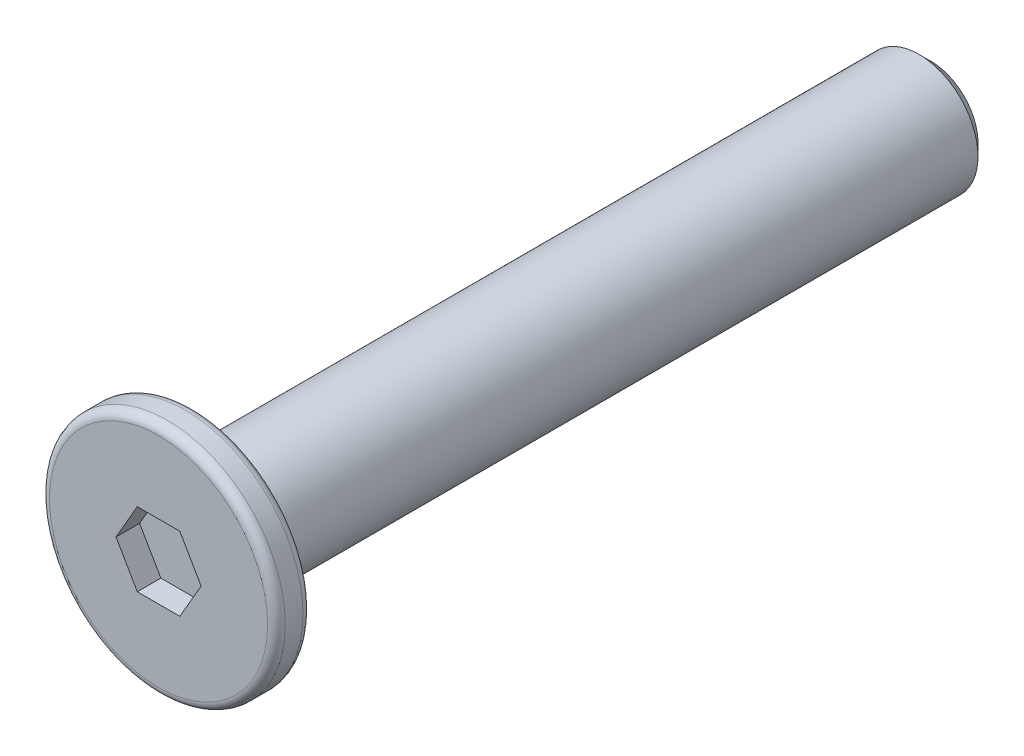
ISO-10303-21;
HEADER;
FILE_DESCRIPTION(('STEP AP214'),'2;1');
FILE_NAME('part.step','',(''),(''),'','','');
FILE_SCHEMA(('AUTOMOTIVE_DESIGN { 1 0 10303 214 1 1 1 1 }'));
ENDSEC;
DATA;
#1=APPLICATION_CONTEXT('core data for automotive mechanical design processes');
#2=APPLICATION_PROTOCOL_DEFINITION('international standard','automotive_design',2000,#1);
#3=PRODUCT_CONTEXT('',#1,'mechanical');
#4=PRODUCT('Part','Part','',(#3));
#5=PRODUCT_RELATED_PRODUCT_CATEGORY('part','',(#4));
#6=PRODUCT_DEFINITION_FORMATION('','',#4);
#7=PRODUCT_DEFINITION_CONTEXT('part definition',#1,'design');
#8=PRODUCT_DEFINITION('design','',#6,#7);
#9=PRODUCT_DEFINITION_SHAPE('','',#8);
#10=(LENGTH_UNIT() NAMED_UNIT(*) SI_UNIT(.MILLI.,.METRE.));
#11=(NAMED_UNIT(*) PLANE_ANGLE_UNIT() SI_UNIT($,.RADIAN.));
#12=(NAMED_UNIT(*) SI_UNIT($,.STERADIAN.) SOLID_ANGLE_UNIT());
#13=UNCERTAINTY_MEASURE_WITH_UNIT(LENGTH_MEASURE(1.E-05),#10,'distance_accuracy_value','');
#14=(GEOMETRIC_REPRESENTATION_CONTEXT(3) GLOBAL_UNCERTAINTY_ASSIGNED_CONTEXT((#13)) GLOBAL_UNIT_ASSIGNED_CONTEXT((#10,
#11,#12)) REPRESENTATION_CONTEXT('',''));
#15=CARTESIAN_POINT('',(0.,0.,0.));
#16=DIRECTION('',(0.,0.,1.));
#17=DIRECTION('',(1.,0.,0.));
#18=AXIS2_PLACEMENT_3D('',#15,#16,#17);
#19=CARTESIAN_POINT('',(0.,0.,0.6));
#20=DIRECTION('',(0.,0.,-1.));
#21=DIRECTION('',(-1.,0.,0.));
#22=AXIS2_PLACEMENT_3D('',#19,#20,#21);
#23=CYLINDRICAL_SURFACE('',#22,4.);
#24=CARTESIAN_POINT('',(0.,0.,-0.3));
#25=DIRECTION('',(0.,0.,1.));
#26=DIRECTION('',(1.,0.,0.));
#27=AXIS2_PLACEMENT_3D('',#24,#25,#26);
#28=CIRCLE('',#27,4.);
#29=CARTESIAN_POINT('',(4.,0.,-0.3));
#30=VERTEX_POINT('',#29);
#31=EDGE_CURVE('E154',#30,#30,#28,.T.);
#32=ORIENTED_EDGE('',*,*,#31,.T.);
#33=EDGE_LOOP('',(#32));
#34=FACE_BOUND('',#33,.T.);
#35=CARTESIAN_POINT('',(0.,0.,0.3));
#36=DIRECTION('',(0.,0.,1.));
#37=DIRECTION('',(1.,0.,0.));
#38=AXIS2_PLACEMENT_3D('',#35,#36,#37);
#39=CIRCLE('',#38,4.);
#40=CARTESIAN_POINT('',(4.,0.,0.3));
#41=VERTEX_POINT('',#40);
#42=EDGE_CURVE('E151',#41,#41,#39,.F.);
#43=ORIENTED_EDGE('',*,*,#42,.T.);
#44=EDGE_LOOP('',(#43));
#45=FACE_BOUND('',#44,.T.);
#46=ADVANCED_FACE('F35',(#34,#45),#23,.T.);
#47=CARTESIAN_POINT('',(0.,0.,0.6));
#48=DIRECTION('',(0.,0.,1.));
#49=DIRECTION('',(1.,0.,0.));
#50=AXIS2_PLACEMENT_3D('',#47,#48,#49);
#51=PLANE('',#50);
#52=CARTESIAN_POINT('',(0.,0.,0.6));
#53=DIRECTION('',(0.,0.,1.));
#54=DIRECTION('',(1.,0.,0.));
#55=AXIS2_PLACEMENT_3D('',#52,#53,#54);
#56=CIRCLE('',#55,3.7);
#57=CARTESIAN_POINT('',(3.7,0.,0.6));
#58=VERTEX_POINT('',#57);
#59=EDGE_CURVE('E11',#58,#58,#56,.T.);
#60=ORIENTED_EDGE('',*,*,#59,.T.);
#61=EDGE_LOOP('',(#60));
#62=FACE_BOUND('',#61,.T.);
#63=DIRECTION('',(0.5,0.866025403784439,0.));
#64=VECTOR('',#63,1.);
#65=CARTESIAN_POINT('',(0.721687836487033,-1.25,0.6));
#66=LINE('',#65,#64);
#67=CARTESIAN_POINT('',(0.721687836487033,-1.25,0.6));
#68=VERTEX_POINT('',#67);
#69=CARTESIAN_POINT('',(1.44337567297407,0.,0.6));
#70=VERTEX_POINT('',#69);
#71=EDGE_CURVE('E50',#68,#70,#66,.T.);
#72=ORIENTED_EDGE('',*,*,#71,.F.);
#73=DIRECTION('',(1.,0.,0.));
#74=VECTOR('',#73,1.);
#75=CARTESIAN_POINT('',(-0.721687836487031,-1.25,0.6));
#76=LINE('',#75,#74);
#77=CARTESIAN_POINT('',(-0.721687836487031,-1.25,0.6));
#78=VERTEX_POINT('',#77);
#79=EDGE_CURVE('E133',#78,#68,#76,.T.);
#80=ORIENTED_EDGE('',*,*,#79,.F.);
#81=DIRECTION('',(0.5,-0.866025403784438,0.));
#82=VECTOR('',#81,1.);
#83=CARTESIAN_POINT('',(-1.44337567297406,0.,0.6));
#84=LINE('',#83,#82);
#85=CARTESIAN_POINT('',(-1.44337567297406,0.,0.6));
#86=VERTEX_POINT('',#85);
#87=EDGE_CURVE('E131',#86,#78,#84,.T.);
#88=ORIENTED_EDGE('',*,*,#87,.F.);
#89=DIRECTION('',(-0.5,-0.866025403784439,0.));
#90=VECTOR('',#89,1.);
#91=CARTESIAN_POINT('',(-0.721687836487032,1.25,0.6));
#92=LINE('',#91,#90);
#93=CARTESIAN_POINT('',(-0.721687836487032,1.25,0.6));
#94=VERTEX_POINT('',#93);
#95=EDGE_CURVE('E98',#94,#86,#92,.T.);
#96=ORIENTED_EDGE('',*,*,#95,.F.);
#97=DIRECTION('',(-1.,0.,0.));
#98=VECTOR('',#97,1.);
#99=CARTESIAN_POINT('',(0.721687836487032,1.25,0.6));
#100=LINE('',#99,#98);
#101=CARTESIAN_POINT('',(0.721687836487032,1.25,0.6));
#102=VERTEX_POINT('',#101);
#103=EDGE_CURVE('E127',#102,#94,#100,.T.);
#104=ORIENTED_EDGE('',*,*,#103,.F.);
#105=DIRECTION('',(-0.500000000000001,0.866025403784438,0.));
#106=VECTOR('',#105,1.);
#107=CARTESIAN_POINT('',(1.44337567297407,0.,0.6));
#108=LINE('',#107,#106);
#109=EDGE_CURVE('E124',#70,#102,#108,.T.);
#110=ORIENTED_EDGE('',*,*,#109,.F.);
#111=EDGE_LOOP('',(#72,#80,#88,#96,#104,#110));
#112=FACE_BOUND('',#111,.T.);
#113=ADVANCED_FACE('F169',(#62,#112),#51,.T.);
#114=CARTESIAN_POINT('',(0.,0.,-0.6));
#115=DIRECTION('',(0.,0.,1.));
#116=DIRECTION('',(1.,0.,0.));
#117=AXIS2_PLACEMENT_3D('',#114,#115,#116);
#118=PLANE('',#117);
#119=CARTESIAN_POINT('',(0.,0.,-0.6));
#120=DIRECTION('',(0.,0.,1.));
#121=DIRECTION('',(1.,0.,0.));
#122=AXIS2_PLACEMENT_3D('',#119,#120,#121);
#123=CIRCLE('',#122,3.7);
#124=CARTESIAN_POINT('',(3.7,0.,-0.6));
#125=VERTEX_POINT('',#124);
#126=EDGE_CURVE('E43',#125,#125,#123,.F.);
#127=ORIENTED_EDGE('',*,*,#126,.T.);
#128=EDGE_LOOP('',(#127));
#129=FACE_BOUND('',#128,.T.);
#130=CARTESIAN_POINT('',(0.,0.,-0.6));
#131=DIRECTION('',(0.,0.,-1.));
#132=DIRECTION('',(-1.,0.,0.));
#133=AXIS2_PLACEMENT_3D('',#130,#131,#132);
#134=CIRCLE('',#133,2.);
#135=CARTESIAN_POINT('',(-2.,0.,-0.6));
#136=VERTEX_POINT('',#135);
#137=EDGE_CURVE('E137',#136,#136,#134,.T.);
#138=ORIENTED_EDGE('',*,*,#137,.F.);
#139=EDGE_LOOP('',(#138));
#140=FACE_BOUND('',#139,.T.);
#141=ADVANCED_FACE('F159',(#129,#140),#118,.F.);
#142=CARTESIAN_POINT('',(0.,0.,-25.6));
#143=DIRECTION('',(0.,0.,1.));
#144=DIRECTION('',(1.,0.,0.));
#145=AXIS2_PLACEMENT_3D('',#142,#143,#144);
#146=CYLINDRICAL_SURFACE('',#145,2.);
#147=CARTESIAN_POINT('',(0.,0.,-25.2));
#148=DIRECTION('',(0.,0.,-1.));
#149=DIRECTION('',(-1.,0.,0.));
#150=AXIS2_PLACEMENT_3D('',#147,#148,#149);
#151=CIRCLE('',#150,2.);
#152=CARTESIAN_POINT('',(-2.,0.,-25.2));
#153=VERTEX_POINT('',#152);
#154=EDGE_CURVE('E148',#153,#153,#151,.F.);
#155=ORIENTED_EDGE('',*,*,#154,.T.);
#156=EDGE_LOOP('',(#155));
#157=FACE_BOUND('',#156,.T.);
#158=ORIENTED_EDGE('',*,*,#137,.T.);
#159=EDGE_LOOP('',(#158));
#160=FACE_BOUND('',#159,.T.);
#161=ADVANCED_FACE('F204',(#157,#160),#146,.T.);
#162=CARTESIAN_POINT('',(0.,0.,-25.6));
#163=DIRECTION('',(0.,0.,-1.));
#164=DIRECTION('',(-1.,0.,0.));
#165=AXIS2_PLACEMENT_3D('',#162,#163,#164);
#166=PLANE('',#165);
#167=CARTESIAN_POINT('',(0.,0.,-25.6));
#168=DIRECTION('',(0.,0.,-1.));
#169=DIRECTION('',(-1.,0.,0.));
#170=AXIS2_PLACEMENT_3D('',#167,#168,#169);
#171=CIRCLE('',#170,1.6);
#172=CARTESIAN_POINT('',(-1.6,0.,-25.6));
#173=VERTEX_POINT('',#172);
#174=EDGE_CURVE('E145',#173,#173,#171,.T.);
#175=ORIENTED_EDGE('',*,*,#174,.T.);
#176=EDGE_LOOP('',(#175));
#177=FACE_BOUND('',#176,.T.);
#178=ADVANCED_FACE('F196',(#177),#166,.T.);
#179=CARTESIAN_POINT('',(0.,0.,-25.6));
#180=DIRECTION('',(0.,0.,1.));
#181=DIRECTION('',(1.,0.,0.));
#182=AXIS2_PLACEMENT_3D('',#179,#180,#181);
#183=CONICAL_SURFACE('',#182,1.6,0.78539816339745);
#184=ORIENTED_EDGE('',*,*,#154,.F.);
#185=EDGE_LOOP('',(#184));
#186=FACE_BOUND('',#185,.T.);
#187=ORIENTED_EDGE('',*,*,#174,.F.);
#188=EDGE_LOOP('',(#187));
#189=FACE_BOUND('',#188,.T.);
#190=ADVANCED_FACE('F189',(#186,#189),#183,.T.);
#191=CARTESIAN_POINT('',(0.721687836487033,-1.25,-0.2));
#192=DIRECTION('',(0.866025403784439,-0.5,0.));
#193=DIRECTION('',(0.5,0.866025403784439,0.));
#194=AXIS2_PLACEMENT_3D('',#191,#192,#193);
#195=PLANE('',#194);
#196=ORIENTED_EDGE('',*,*,#71,.T.);
#197=DIRECTION('',(0.,0.,1.));
#198=VECTOR('',#197,1.);
#199=CARTESIAN_POINT('',(1.44337567297407,0.,-0.2));
#200=LINE('',#199,#198);
#201=CARTESIAN_POINT('',(1.44337567297407,0.,-0.2));
#202=VERTEX_POINT('',#201);
#203=EDGE_CURVE('E80',#202,#70,#200,.T.);
#204=ORIENTED_EDGE('',*,*,#203,.F.);
#205=DIRECTION('',(0.5,0.866025403784439,0.));
#206=VECTOR('',#205,1.);
#207=CARTESIAN_POINT('',(0.721687836487033,-1.25,-0.2));
#208=LINE('',#207,#206);
#209=CARTESIAN_POINT('',(0.721687836487033,-1.25,-0.2));
#210=VERTEX_POINT('',#209);
#211=EDGE_CURVE('E135',#210,#202,#208,.T.);
#212=ORIENTED_EDGE('',*,*,#211,.F.);
#213=DIRECTION('',(0.,0.,1.));
#214=VECTOR('',#213,1.);
#215=CARTESIAN_POINT('',(0.721687836487033,-1.25,-0.2));
#216=LINE('',#215,#214);
#217=EDGE_CURVE('E58',#210,#68,#216,.T.);
#218=ORIENTED_EDGE('',*,*,#217,.T.);
#219=EDGE_LOOP('',(#196,#204,#212,#218));
#220=FACE_BOUND('',#219,.T.);
#221=ADVANCED_FACE('F186',(#220),#195,.F.);
#222=CARTESIAN_POINT('',(-0.721687836487031,-1.25,-0.2));
#223=DIRECTION('',(0.,-1.,0.));
#224=DIRECTION('',(0.,0.,-1.));
#225=AXIS2_PLACEMENT_3D('',#222,#223,#224);
#226=PLANE('',#225);
#227=ORIENTED_EDGE('',*,*,#79,.T.);
#228=ORIENTED_EDGE('',*,*,#217,.F.);
#229=DIRECTION('',(1.,0.,0.));
#230=VECTOR('',#229,1.);
#231=CARTESIAN_POINT('',(-0.721687836487031,-1.25,-0.2));
#232=LINE('',#231,#230);
#233=CARTESIAN_POINT('',(-0.721687836487031,-1.25,-0.2));
#234=VERTEX_POINT('',#233);
#235=EDGE_CURVE('E110',#234,#210,#232,.T.);
#236=ORIENTED_EDGE('',*,*,#235,.F.);
#237=DIRECTION('',(0.,0.,1.));
#238=VECTOR('',#237,1.);
#239=CARTESIAN_POINT('',(-0.721687836487031,-1.25,-0.2));
#240=LINE('',#239,#238);
#241=EDGE_CURVE('E102',#234,#78,#240,.T.);
#242=ORIENTED_EDGE('',*,*,#241,.T.);
#243=EDGE_LOOP('',(#227,#228,#236,#242));
#244=FACE_BOUND('',#243,.T.);
#245=ADVANCED_FACE('F188',(#244),#226,.F.);
#246=CARTESIAN_POINT('',(-1.44337567297406,0.,-0.2));
#247=DIRECTION('',(-0.866025403784438,-0.5,0.));
#248=DIRECTION('',(0.5,-0.866025403784438,0.));
#249=AXIS2_PLACEMENT_3D('',#246,#247,#248);
#250=PLANE('',#249);
#251=ORIENTED_EDGE('',*,*,#87,.T.);
#252=ORIENTED_EDGE('',*,*,#241,.F.);
#253=DIRECTION('',(0.5,-0.866025403784438,0.));
#254=VECTOR('',#253,1.);
#255=CARTESIAN_POINT('',(-1.44337567297406,0.,-0.2));
#256=LINE('',#255,#254);
#257=CARTESIAN_POINT('',(-1.44337567297406,0.,-0.2));
#258=VERTEX_POINT('',#257);
#259=EDGE_CURVE('E106',#258,#234,#256,.T.);
#260=ORIENTED_EDGE('',*,*,#259,.F.);
#261=DIRECTION('',(0.,0.,1.));
#262=VECTOR('',#261,1.);
#263=CARTESIAN_POINT('',(-1.44337567297406,0.,-0.2));
#264=LINE('',#263,#262);
#265=EDGE_CURVE('E91',#258,#86,#264,.T.);
#266=ORIENTED_EDGE('',*,*,#265,.T.);
#267=EDGE_LOOP('',(#251,#252,#260,#266));
#268=FACE_BOUND('',#267,.T.);
#269=ADVANCED_FACE('F107',(#268),#250,.F.);
#270=CARTESIAN_POINT('',(-0.721687836487032,1.25,-0.2));
#271=DIRECTION('',(-0.866025403784439,0.5,0.));
#272=DIRECTION('',(-0.5,-0.866025403784439,0.));
#273=AXIS2_PLACEMENT_3D('',#270,#271,#272);
#274=PLANE('',#273);
#275=ORIENTED_EDGE('',*,*,#95,.T.);
#276=ORIENTED_EDGE('',*,*,#265,.F.);
#277=DIRECTION('',(-0.5,-0.866025403784439,0.));
#278=VECTOR('',#277,1.);
#279=CARTESIAN_POINT('',(-0.721687836487032,1.25,-0.2));
#280=LINE('',#279,#278);
#281=CARTESIAN_POINT('',(-0.721687836487032,1.25,-0.2));
#282=VERTEX_POINT('',#281);
#283=EDGE_CURVE('E95',#282,#258,#280,.T.);
#284=ORIENTED_EDGE('',*,*,#283,.F.);
#285=DIRECTION('',(0.,0.,1.));
#286=VECTOR('',#285,1.);
#287=CARTESIAN_POINT('',(-0.721687836487032,1.25,-0.2));
#288=LINE('',#287,#286);
#289=EDGE_CURVE('E103',#282,#94,#288,.T.);
#290=ORIENTED_EDGE('',*,*,#289,.T.);
#291=EDGE_LOOP('',(#275,#276,#284,#290));
#292=FACE_BOUND('',#291,.T.);
#293=ADVANCED_FACE('F93',(#292),#274,.F.);
#294=CARTESIAN_POINT('',(0.721687836487032,1.25,-0.2));
#295=DIRECTION('',(0.,1.,0.));
#296=DIRECTION('',(0.,0.,1.));
#297=AXIS2_PLACEMENT_3D('',#294,#295,#296);
#298=PLANE('',#297);
#299=ORIENTED_EDGE('',*,*,#103,.T.);
#300=ORIENTED_EDGE('',*,*,#289,.F.);
#301=DIRECTION('',(-1.,0.,0.));
#302=VECTOR('',#301,1.);
#303=CARTESIAN_POINT('',(0.721687836487032,1.25,-0.2));
#304=LINE('',#303,#302);
#305=CARTESIAN_POINT('',(0.721687836487032,1.25,-0.2));
#306=VERTEX_POINT('',#305);
#307=EDGE_CURVE('E116',#306,#282,#304,.T.);
#308=ORIENTED_EDGE('',*,*,#307,.F.);
#309=DIRECTION('',(0.,0.,1.));
#310=VECTOR('',#309,1.);
#311=CARTESIAN_POINT('',(0.721687836487032,1.25,-0.2));
#312=LINE('',#311,#310);
#313=EDGE_CURVE('E140',#306,#102,#312,.T.);
#314=ORIENTED_EDGE('',*,*,#313,.T.);
#315=EDGE_LOOP('',(#299,#300,#308,#314));
#316=FACE_BOUND('',#315,.T.);
#317=ADVANCED_FACE('F257',(#316),#298,.F.);
#318=CARTESIAN_POINT('',(1.44337567297407,0.,-0.2));
#319=DIRECTION('',(0.866025403784438,0.500000000000001,0.));
#320=DIRECTION('',(-0.500000000000001,0.866025403784438,0.));
#321=AXIS2_PLACEMENT_3D('',#318,#319,#320);
#322=PLANE('',#321);
#323=ORIENTED_EDGE('',*,*,#109,.T.);
#324=ORIENTED_EDGE('',*,*,#313,.F.);
#325=DIRECTION('',(-0.500000000000001,0.866025403784438,0.));
#326=VECTOR('',#325,1.);
#327=CARTESIAN_POINT('',(1.44337567297407,0.,-0.2));
#328=LINE('',#327,#326);
#329=EDGE_CURVE('E118',#202,#306,#328,.T.);
#330=ORIENTED_EDGE('',*,*,#329,.F.);
#331=ORIENTED_EDGE('',*,*,#203,.T.);
#332=EDGE_LOOP('',(#323,#324,#330,#331));
#333=FACE_BOUND('',#332,.T.);
#334=ADVANCED_FACE('F184',(#333),#322,.F.);
#335=CARTESIAN_POINT('',(0.,0.,-0.2));
#336=DIRECTION('',(0.,0.,1.));
#337=DIRECTION('',(1.,0.,0.));
#338=AXIS2_PLACEMENT_3D('',#335,#336,#337);
#339=PLANE('',#338);
#340=ORIENTED_EDGE('',*,*,#211,.T.);
#341=ORIENTED_EDGE('',*,*,#329,.T.);
#342=ORIENTED_EDGE('',*,*,#307,.T.);
#343=ORIENTED_EDGE('',*,*,#283,.T.);
#344=ORIENTED_EDGE('',*,*,#259,.T.);
#345=ORIENTED_EDGE('',*,*,#235,.T.);
#346=EDGE_LOOP('',(#340,#341,#342,#343,#344,#345));
#347=FACE_BOUND('',#346,.T.);
#348=ADVANCED_FACE('F113',(#347),#339,.T.);
#349=CARTESIAN_POINT('',(0.,0.,-0.3));
#350=DIRECTION('',(0.,0.,1.));
#351=DIRECTION('',(1.,0.,0.));
#352=AXIS2_PLACEMENT_3D('',#349,#350,#351);
#353=TOROIDAL_SURFACE('',#352,3.7,0.3);
#354=ORIENTED_EDGE('',*,*,#126,.F.);
#355=EDGE_LOOP('',(#354));
#356=FACE_BOUND('',#355,.T.);
#357=ORIENTED_EDGE('',*,*,#31,.F.);
#358=EDGE_LOOP('',(#357));
#359=FACE_BOUND('',#358,.T.);
#360=ADVANCED_FACE('F162',(#356,#359),#353,.T.);
#361=CARTESIAN_POINT('',(0.,0.,0.3));
#362=DIRECTION('',(0.,0.,1.));
#363=DIRECTION('',(1.,0.,0.));
#364=AXIS2_PLACEMENT_3D('',#361,#362,#363);
#365=TOROIDAL_SURFACE('',#364,3.7,0.3);
#366=ORIENTED_EDGE('',*,*,#42,.F.);
#367=EDGE_LOOP('',(#366));
#368=FACE_BOUND('',#367,.T.);
#369=ORIENTED_EDGE('',*,*,#59,.F.);
#370=EDGE_LOOP('',(#369));
#371=FACE_BOUND('',#370,.T.);
#372=ADVANCED_FACE('F37',(#368,#371),#365,.T.);
#373=CLOSED_SHELL('',(#46,#113,#141,#161,#178,#190,#221,#245,#269,#293,#317,#334,#348,#360,#372));
#374=MANIFOLD_SOLID_BREP('B2',#373);
#375=ADVANCED_BREP_SHAPE_REPRESENTATION('',(#18,#374),#14);
#376=SHAPE_DEFINITION_REPRESENTATION(#9,#375);
ENDSEC;
END-ISO-10303-21;
